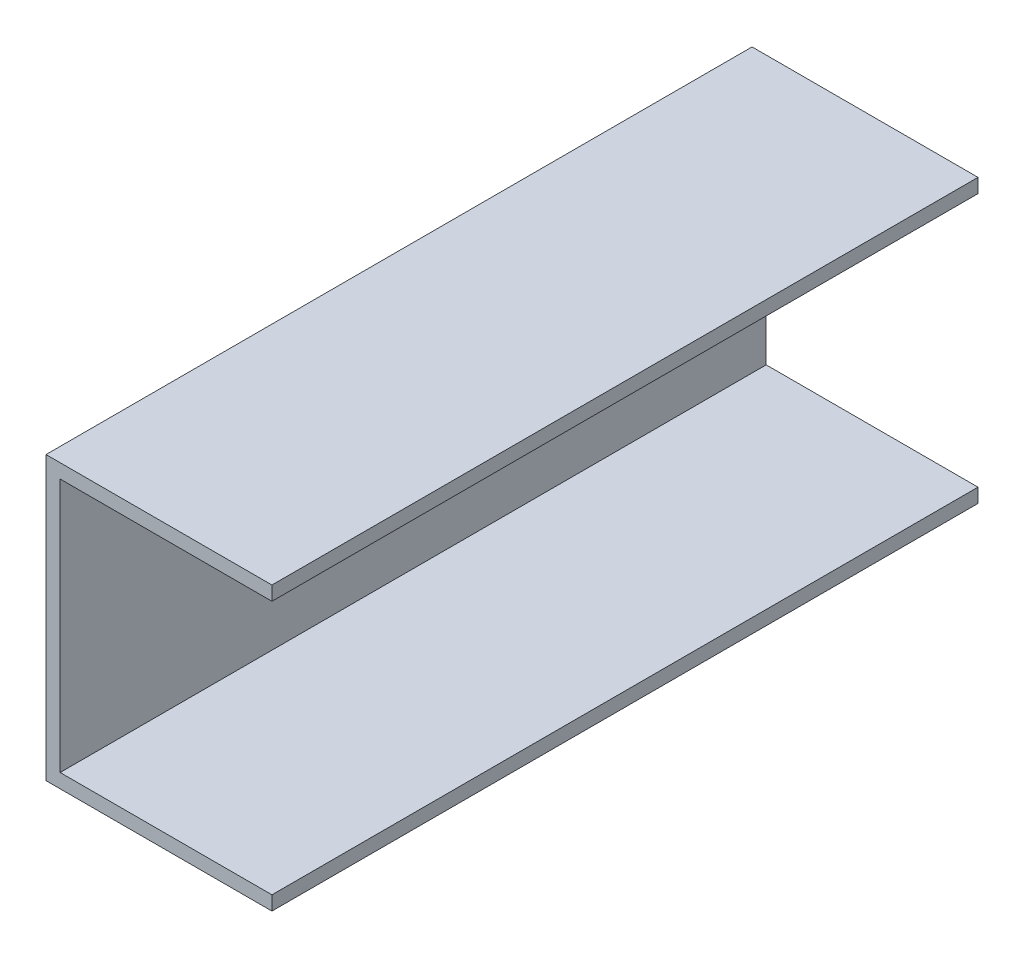
ISO-10303-21;
HEADER;
FILE_DESCRIPTION(('STEP AP214'),'2;1');
FILE_NAME('part.step','',(''),(''),'','','');
FILE_SCHEMA(('AUTOMOTIVE_DESIGN { 1 0 10303 214 1 1 1 1 }'));
ENDSEC;
DATA;
#1=APPLICATION_CONTEXT('core data for automotive mechanical design processes');
#2=APPLICATION_PROTOCOL_DEFINITION('international standard','automotive_design',2000,#1);
#3=PRODUCT_CONTEXT('',#1,'mechanical');
#4=PRODUCT('Part','Part','',(#3));
#5=PRODUCT_RELATED_PRODUCT_CATEGORY('part','',(#4));
#6=PRODUCT_DEFINITION_FORMATION('','',#4);
#7=PRODUCT_DEFINITION_CONTEXT('part definition',#1,'design');
#8=PRODUCT_DEFINITION('design','',#6,#7);
#9=PRODUCT_DEFINITION_SHAPE('','',#8);
#10=(LENGTH_UNIT() NAMED_UNIT(*) SI_UNIT(.MILLI.,.METRE.));
#11=(NAMED_UNIT(*) PLANE_ANGLE_UNIT() SI_UNIT($,.RADIAN.));
#12=(NAMED_UNIT(*) SI_UNIT($,.STERADIAN.) SOLID_ANGLE_UNIT());
#13=UNCERTAINTY_MEASURE_WITH_UNIT(LENGTH_MEASURE(1.E-05),#10,'distance_accuracy_value','');
#14=(GEOMETRIC_REPRESENTATION_CONTEXT(3) GLOBAL_UNCERTAINTY_ASSIGNED_CONTEXT((#13)) GLOBAL_UNIT_ASSIGNED_CONTEXT((#10,
#11,#12)) REPRESENTATION_CONTEXT('',''));
#15=CARTESIAN_POINT('',(0.,0.,0.));
#16=DIRECTION('',(0.,0.,1.));
#17=DIRECTION('',(1.,0.,0.));
#18=AXIS2_PLACEMENT_3D('',#15,#16,#17);
#19=CARTESIAN_POINT('',(-0.6,0.025,0.625));
#20=DIRECTION('',(-1.,0.,0.));
#21=DIRECTION('',(0.,0.,1.));
#22=AXIS2_PLACEMENT_3D('',#19,#20,#21);
#23=PLANE('',#22);
#24=DIRECTION('',(0.,0.,1.));
#25=VECTOR('',#24,1.);
#26=CARTESIAN_POINT('',(-0.6,0.025,0.625));
#27=LINE('',#26,#25);
#28=CARTESIAN_POINT('',(-0.6,0.025,-0.625));
#29=VERTEX_POINT('',#28);
#30=CARTESIAN_POINT('',(-0.6,0.025,0.625));
#31=VERTEX_POINT('',#30);
#32=EDGE_CURVE('E112',#29,#31,#27,.T.);
#33=ORIENTED_EDGE('',*,*,#32,.T.);
#34=DIRECTION('',(0.,1.,0.));
#35=VECTOR('',#34,1.);
#36=CARTESIAN_POINT('',(-0.6,0.,0.625));
#37=LINE('',#36,#35);
#38=CARTESIAN_POINT('',(-0.6,0.,0.625));
#39=VERTEX_POINT('',#38);
#40=EDGE_CURVE('E136',#31,#39,#37,.F.);
#41=ORIENTED_EDGE('',*,*,#40,.T.);
#42=DIRECTION('',(0.,0.,1.));
#43=VECTOR('',#42,1.);
#44=CARTESIAN_POINT('',(-0.6,0.,0.625));
#45=LINE('',#44,#43);
#46=CARTESIAN_POINT('',(-0.6,0.,-0.625));
#47=VERTEX_POINT('',#46);
#48=EDGE_CURVE('E130',#39,#47,#45,.F.);
#49=ORIENTED_EDGE('',*,*,#48,.T.);
#50=DIRECTION('',(0.,1.,0.));
#51=VECTOR('',#50,1.);
#52=CARTESIAN_POINT('',(-0.6,0.,-0.625));
#53=LINE('',#52,#51);
#54=EDGE_CURVE('E128',#29,#47,#53,.F.);
#55=ORIENTED_EDGE('',*,*,#54,.F.);
#56=EDGE_LOOP('',(#33,#41,#49,#55));
#57=FACE_BOUND('',#56,.T.);
#58=ADVANCED_FACE('F17',(#57),#23,.F.);
#59=CARTESIAN_POINT('',(-0.6,0.5,0.625));
#60=DIRECTION('',(-1.,0.,0.));
#61=DIRECTION('',(0.,0.,1.));
#62=AXIS2_PLACEMENT_3D('',#59,#60,#61);
#63=PLANE('',#62);
#64=DIRECTION('',(0.,0.,1.));
#65=VECTOR('',#64,1.);
#66=CARTESIAN_POINT('',(-0.6,0.5,0.625));
#67=LINE('',#66,#65);
#68=CARTESIAN_POINT('',(-0.6,0.5,-0.625));
#69=VERTEX_POINT('',#68);
#70=CARTESIAN_POINT('',(-0.6,0.5,0.625));
#71=VERTEX_POINT('',#70);
#72=EDGE_CURVE('E84',#69,#71,#67,.T.);
#73=ORIENTED_EDGE('',*,*,#72,.T.);
#74=DIRECTION('',(0.,1.,0.));
#75=VECTOR('',#74,1.);
#76=CARTESIAN_POINT('',(-0.6,0.,0.625));
#77=LINE('',#76,#75);
#78=CARTESIAN_POINT('',(-0.6,0.475,0.625));
#79=VERTEX_POINT('',#78);
#80=EDGE_CURVE('E87',#71,#79,#77,.F.);
#81=ORIENTED_EDGE('',*,*,#80,.T.);
#82=DIRECTION('',(0.,0.,1.));
#83=VECTOR('',#82,1.);
#84=CARTESIAN_POINT('',(-0.6,0.475,0.625));
#85=LINE('',#84,#83);
#86=CARTESIAN_POINT('',(-0.6,0.475,-0.625));
#87=VERTEX_POINT('',#86);
#88=EDGE_CURVE('E20',#79,#87,#85,.F.);
#89=ORIENTED_EDGE('',*,*,#88,.T.);
#90=DIRECTION('',(0.,1.,0.));
#91=VECTOR('',#90,1.);
#92=CARTESIAN_POINT('',(-0.6,0.,-0.625));
#93=LINE('',#92,#91);
#94=EDGE_CURVE('E88',#69,#87,#93,.F.);
#95=ORIENTED_EDGE('',*,*,#94,.F.);
#96=EDGE_LOOP('',(#73,#81,#89,#95));
#97=FACE_BOUND('',#96,.T.);
#98=ADVANCED_FACE('F86',(#97),#63,.F.);
#99=CARTESIAN_POINT('',(-0.975,0.475,0.625));
#100=DIRECTION('',(0.,1.,0.));
#101=DIRECTION('',(0.,0.,1.));
#102=AXIS2_PLACEMENT_3D('',#99,#100,#101);
#103=PLANE('',#102);
#104=ORIENTED_EDGE('',*,*,#88,.F.);
#105=DIRECTION('',(-1.,0.,0.));
#106=VECTOR('',#105,1.);
#107=CARTESIAN_POINT('',(0.,0.475,0.625));
#108=LINE('',#107,#106);
#109=CARTESIAN_POINT('',(-0.975,0.475,0.625));
#110=VERTEX_POINT('',#109);
#111=EDGE_CURVE('E102',#79,#110,#108,.T.);
#112=ORIENTED_EDGE('',*,*,#111,.T.);
#113=DIRECTION('',(0.,0.,1.));
#114=VECTOR('',#113,1.);
#115=CARTESIAN_POINT('',(-0.975,0.475,0.625));
#116=LINE('',#115,#114);
#117=CARTESIAN_POINT('',(-0.975,0.475,-0.625));
#118=VERTEX_POINT('',#117);
#119=EDGE_CURVE('E113',#110,#118,#116,.F.);
#120=ORIENTED_EDGE('',*,*,#119,.T.);
#121=DIRECTION('',(-1.,0.,0.));
#122=VECTOR('',#121,1.);
#123=CARTESIAN_POINT('',(0.,0.475,-0.625));
#124=LINE('',#123,#122);
#125=EDGE_CURVE('E116',#87,#118,#124,.T.);
#126=ORIENTED_EDGE('',*,*,#125,.F.);
#127=EDGE_LOOP('',(#104,#112,#120,#126));
#128=FACE_BOUND('',#127,.T.);
#129=ADVANCED_FACE('F117',(#128),#103,.F.);
#130=CARTESIAN_POINT('',(-0.975,0.025,0.625));
#131=DIRECTION('',(-1.,0.,0.));
#132=DIRECTION('',(0.,0.,1.));
#133=AXIS2_PLACEMENT_3D('',#130,#131,#132);
#134=PLANE('',#133);
#135=ORIENTED_EDGE('',*,*,#119,.F.);
#136=DIRECTION('',(0.,1.,0.));
#137=VECTOR('',#136,1.);
#138=CARTESIAN_POINT('',(-0.975,0.,0.625));
#139=LINE('',#138,#137);
#140=CARTESIAN_POINT('',(-0.975,0.025,0.625));
#141=VERTEX_POINT('',#140);
#142=EDGE_CURVE('E141',#110,#141,#139,.F.);
#143=ORIENTED_EDGE('',*,*,#142,.T.);
#144=DIRECTION('',(0.,0.,1.));
#145=VECTOR('',#144,1.);
#146=CARTESIAN_POINT('',(-0.975,0.025,0.625));
#147=LINE('',#146,#145);
#148=CARTESIAN_POINT('',(-0.975,0.025,-0.625));
#149=VERTEX_POINT('',#148);
#150=EDGE_CURVE('E94',#141,#149,#147,.F.);
#151=ORIENTED_EDGE('',*,*,#150,.T.);
#152=DIRECTION('',(0.,1.,0.));
#153=VECTOR('',#152,1.);
#154=CARTESIAN_POINT('',(-0.975,0.,-0.625));
#155=LINE('',#154,#153);
#156=EDGE_CURVE('E118',#118,#149,#155,.F.);
#157=ORIENTED_EDGE('',*,*,#156,.F.);
#158=EDGE_LOOP('',(#135,#143,#151,#157));
#159=FACE_BOUND('',#158,.T.);
#160=ADVANCED_FACE('F144',(#159),#134,.F.);
#161=CARTESIAN_POINT('',(-0.6,0.025,0.625));
#162=DIRECTION('',(0.,-1.,0.));
#163=DIRECTION('',(1.,0.,0.));
#164=AXIS2_PLACEMENT_3D('',#161,#162,#163);
#165=PLANE('',#164);
#166=ORIENTED_EDGE('',*,*,#150,.F.);
#167=DIRECTION('',(-1.,0.,0.));
#168=VECTOR('',#167,1.);
#169=CARTESIAN_POINT('',(0.,0.025,0.625));
#170=LINE('',#169,#168);
#171=EDGE_CURVE('E138',#141,#31,#170,.F.);
#172=ORIENTED_EDGE('',*,*,#171,.T.);
#173=ORIENTED_EDGE('',*,*,#32,.F.);
#174=DIRECTION('',(-1.,0.,0.));
#175=VECTOR('',#174,1.);
#176=CARTESIAN_POINT('',(0.,0.025,-0.625));
#177=LINE('',#176,#175);
#178=EDGE_CURVE('E120',#149,#29,#177,.F.);
#179=ORIENTED_EDGE('',*,*,#178,.F.);
#180=EDGE_LOOP('',(#166,#172,#173,#179));
#181=FACE_BOUND('',#180,.T.);
#182=ADVANCED_FACE('F148',(#181),#165,.F.);
#183=CARTESIAN_POINT('',(-1.,0.5,0.625));
#184=DIRECTION('',(0.,-1.,0.));
#185=DIRECTION('',(1.,0.,0.));
#186=AXIS2_PLACEMENT_3D('',#183,#184,#185);
#187=PLANE('',#186);
#188=DIRECTION('',(0.,0.,-1.));
#189=VECTOR('',#188,1.);
#190=CARTESIAN_POINT('',(-1.,0.5,0.625));
#191=LINE('',#190,#189);
#192=CARTESIAN_POINT('',(-1.,0.5,-0.625));
#193=VERTEX_POINT('',#192);
#194=CARTESIAN_POINT('',(-1.,0.5,0.625));
#195=VERTEX_POINT('',#194);
#196=EDGE_CURVE('E106',#193,#195,#191,.F.);
#197=ORIENTED_EDGE('',*,*,#196,.T.);
#198=DIRECTION('',(-1.,0.,0.));
#199=VECTOR('',#198,1.);
#200=CARTESIAN_POINT('',(0.,0.5,0.625));
#201=LINE('',#200,#199);
#202=EDGE_CURVE('E93',#195,#71,#201,.F.);
#203=ORIENTED_EDGE('',*,*,#202,.T.);
#204=ORIENTED_EDGE('',*,*,#72,.F.);
#205=DIRECTION('',(-1.,0.,0.));
#206=VECTOR('',#205,1.);
#207=CARTESIAN_POINT('',(0.,0.5,-0.625));
#208=LINE('',#207,#206);
#209=EDGE_CURVE('E122',#193,#69,#208,.F.);
#210=ORIENTED_EDGE('',*,*,#209,.F.);
#211=EDGE_LOOP('',(#197,#203,#204,#210));
#212=FACE_BOUND('',#211,.T.);
#213=ADVANCED_FACE('F105',(#212),#187,.F.);
#214=CARTESIAN_POINT('',(0.,0.,0.625));
#215=DIRECTION('',(0.,0.,-1.));
#216=DIRECTION('',(-1.,0.,0.));
#217=AXIS2_PLACEMENT_3D('',#214,#215,#216);
#218=PLANE('',#217);
#219=ORIENTED_EDGE('',*,*,#171,.F.);
#220=ORIENTED_EDGE('',*,*,#142,.F.);
#221=ORIENTED_EDGE('',*,*,#111,.F.);
#222=ORIENTED_EDGE('',*,*,#80,.F.);
#223=ORIENTED_EDGE('',*,*,#202,.F.);
#224=DIRECTION('',(0.,1.,0.));
#225=VECTOR('',#224,1.);
#226=CARTESIAN_POINT('',(-1.,0.,0.625));
#227=LINE('',#226,#225);
#228=CARTESIAN_POINT('',(-1.,0.,0.625));
#229=VERTEX_POINT('',#228);
#230=EDGE_CURVE('E151',#195,#229,#227,.F.);
#231=ORIENTED_EDGE('',*,*,#230,.T.);
#232=DIRECTION('',(-1.,0.,0.));
#233=VECTOR('',#232,1.);
#234=CARTESIAN_POINT('',(-0.6,0.,0.625));
#235=LINE('',#234,#233);
#236=EDGE_CURVE('E133',#229,#39,#235,.F.);
#237=ORIENTED_EDGE('',*,*,#236,.T.);
#238=ORIENTED_EDGE('',*,*,#40,.F.);
#239=EDGE_LOOP('',(#219,#220,#221,#222,#223,#231,#237,#238));
#240=FACE_BOUND('',#239,.T.);
#241=ADVANCED_FACE('F98',(#240),#218,.F.);
#242=CARTESIAN_POINT('',(-0.6,0.,0.625));
#243=DIRECTION('',(0.,1.,0.));
#244=DIRECTION('',(-1.,0.,0.));
#245=AXIS2_PLACEMENT_3D('',#242,#243,#244);
#246=PLANE('',#245);
#247=ORIENTED_EDGE('',*,*,#48,.F.);
#248=ORIENTED_EDGE('',*,*,#236,.F.);
#249=DIRECTION('',(0.,0.,-1.));
#250=VECTOR('',#249,1.);
#251=CARTESIAN_POINT('',(-1.,0.,0.625));
#252=LINE('',#251,#250);
#253=CARTESIAN_POINT('',(-1.,0.,-0.625));
#254=VERTEX_POINT('',#253);
#255=EDGE_CURVE('E26',#229,#254,#252,.T.);
#256=ORIENTED_EDGE('',*,*,#255,.T.);
#257=DIRECTION('',(-1.,0.,0.));
#258=VECTOR('',#257,1.);
#259=CARTESIAN_POINT('',(0.,0.,-0.625));
#260=LINE('',#259,#258);
#261=EDGE_CURVE('E34',#47,#254,#260,.T.);
#262=ORIENTED_EDGE('',*,*,#261,.F.);
#263=EDGE_LOOP('',(#247,#248,#256,#262));
#264=FACE_BOUND('',#263,.T.);
#265=ADVANCED_FACE('F159',(#264),#246,.F.);
#266=CARTESIAN_POINT('',(0.,0.,-0.625));
#267=DIRECTION('',(0.,0.,-1.));
#268=DIRECTION('',(-1.,0.,0.));
#269=AXIS2_PLACEMENT_3D('',#266,#267,#268);
#270=PLANE('',#269);
#271=ORIENTED_EDGE('',*,*,#156,.T.);
#272=ORIENTED_EDGE('',*,*,#178,.T.);
#273=ORIENTED_EDGE('',*,*,#54,.T.);
#274=ORIENTED_EDGE('',*,*,#261,.T.);
#275=DIRECTION('',(0.,1.,0.));
#276=VECTOR('',#275,1.);
#277=CARTESIAN_POINT('',(-1.,0.,-0.625));
#278=LINE('',#277,#276);
#279=EDGE_CURVE('E11',#254,#193,#278,.T.);
#280=ORIENTED_EDGE('',*,*,#279,.T.);
#281=ORIENTED_EDGE('',*,*,#209,.T.);
#282=ORIENTED_EDGE('',*,*,#94,.T.);
#283=ORIENTED_EDGE('',*,*,#125,.T.);
#284=EDGE_LOOP('',(#271,#272,#273,#274,#280,#281,#282,#283));
#285=FACE_BOUND('',#284,.T.);
#286=ADVANCED_FACE('F162',(#285),#270,.T.);
#287=CARTESIAN_POINT('',(-1.,0.,0.625));
#288=DIRECTION('',(1.,0.,0.));
#289=DIRECTION('',(0.,0.,-1.));
#290=AXIS2_PLACEMENT_3D('',#287,#288,#289);
#291=PLANE('',#290);
#292=ORIENTED_EDGE('',*,*,#255,.F.);
#293=ORIENTED_EDGE('',*,*,#230,.F.);
#294=ORIENTED_EDGE('',*,*,#196,.F.);
#295=ORIENTED_EDGE('',*,*,#279,.F.);
#296=EDGE_LOOP('',(#292,#293,#294,#295));
#297=FACE_BOUND('',#296,.T.);
#298=ADVANCED_FACE('F161',(#297),#291,.F.);
#299=CLOSED_SHELL('',(#58,#98,#129,#160,#182,#213,#241,#265,#286,#298));
#300=MANIFOLD_SOLID_BREP('B1',#299);
#301=ADVANCED_BREP_SHAPE_REPRESENTATION('',(#18,#300),#14);
#302=SHAPE_DEFINITION_REPRESENTATION(#9,#301);
ENDSEC;
END-ISO-10303-21;
